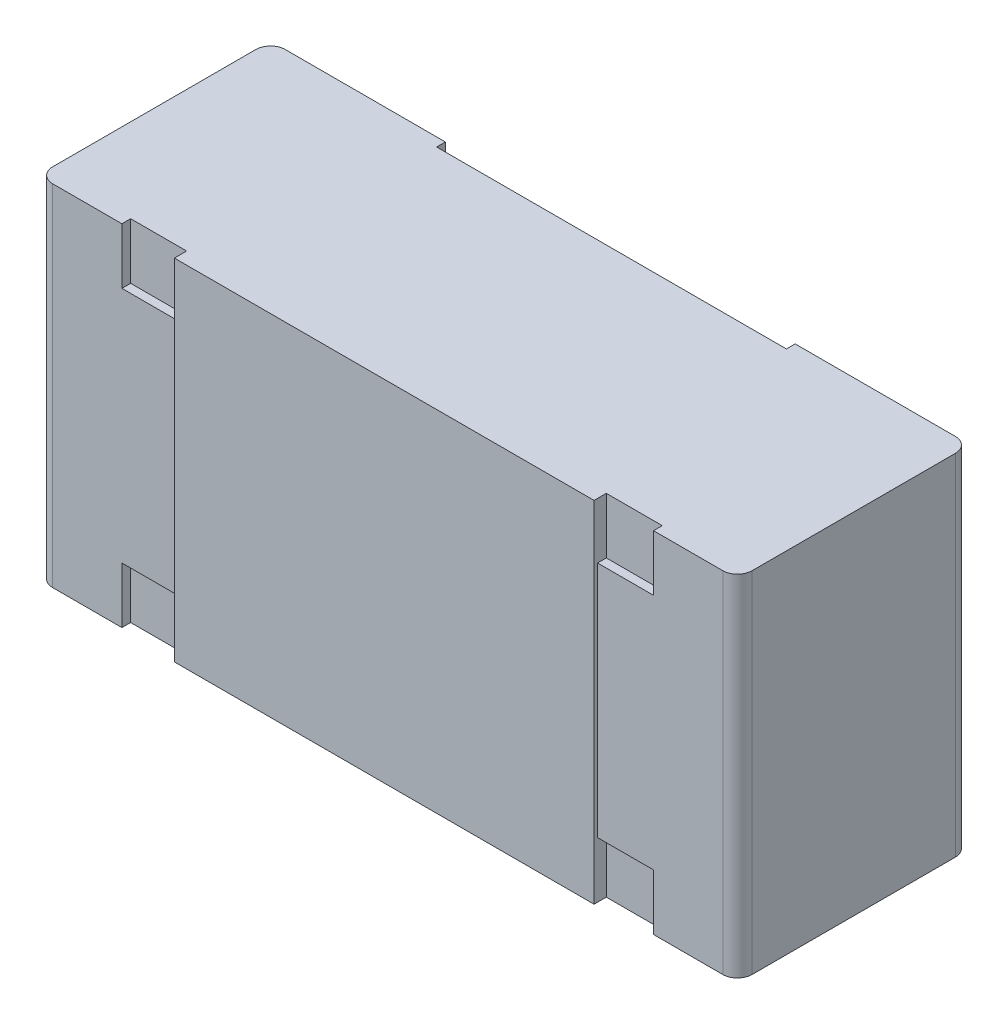
ISO-10303-21;
HEADER;
FILE_DESCRIPTION(('STEP AP214'),'2;1');
FILE_NAME('part.step','',(''),(''),'','','');
FILE_SCHEMA(('AUTOMOTIVE_DESIGN { 1 0 10303 214 1 1 1 1 }'));
ENDSEC;
DATA;
#1=APPLICATION_CONTEXT('core data for automotive mechanical design processes');
#2=APPLICATION_PROTOCOL_DEFINITION('international standard','automotive_design',2000,#1);
#3=PRODUCT_CONTEXT('',#1,'mechanical');
#4=PRODUCT('Part','Part','',(#3));
#5=PRODUCT_RELATED_PRODUCT_CATEGORY('part','',(#4));
#6=PRODUCT_DEFINITION_FORMATION('','',#4);
#7=PRODUCT_DEFINITION_CONTEXT('part definition',#1,'design');
#8=PRODUCT_DEFINITION('design','',#6,#7);
#9=PRODUCT_DEFINITION_SHAPE('','',#8);
#10=(LENGTH_UNIT() NAMED_UNIT(*) SI_UNIT(.MILLI.,.METRE.));
#11=(NAMED_UNIT(*) PLANE_ANGLE_UNIT() SI_UNIT($,.RADIAN.));
#12=(NAMED_UNIT(*) SI_UNIT($,.STERADIAN.) SOLID_ANGLE_UNIT());
#13=UNCERTAINTY_MEASURE_WITH_UNIT(LENGTH_MEASURE(1.E-05),#10,'distance_accuracy_value','');
#14=(GEOMETRIC_REPRESENTATION_CONTEXT(3) GLOBAL_UNCERTAINTY_ASSIGNED_CONTEXT((#13)) GLOBAL_UNIT_ASSIGNED_CONTEXT((#10,
#11,#12)) REPRESENTATION_CONTEXT('',''));
#15=CARTESIAN_POINT('',(0.,0.,0.));
#16=DIRECTION('',(0.,0.,1.));
#17=DIRECTION('',(1.,0.,0.));
#18=AXIS2_PLACEMENT_3D('',#15,#16,#17);
#19=CARTESIAN_POINT('',(-0.5,0.,0.3325));
#20=DIRECTION('',(1.,0.,0.));
#21=DIRECTION('',(0.,0.,-1.));
#22=AXIS2_PLACEMENT_3D('',#19,#20,#21);
#23=PLANE('',#22);
#24=DIRECTION('',(0.,-1.,0.));
#25=VECTOR('',#24,1.);
#26=CARTESIAN_POINT('',(-0.5,0.,0.3115));
#27=LINE('',#26,#25);
#28=CARTESIAN_POINT('',(-0.5,0.25,0.3115));
#29=VERTEX_POINT('',#28);
#30=CARTESIAN_POINT('',(-0.5,-0.25,0.3115));
#31=VERTEX_POINT('',#30);
#32=EDGE_CURVE('E206',#29,#31,#27,.T.);
#33=ORIENTED_EDGE('',*,*,#32,.F.);
#34=DIRECTION('',(0.,0.,-1.));
#35=VECTOR('',#34,1.);
#36=CARTESIAN_POINT('',(-0.5,0.25,0.));
#37=LINE('',#36,#35);
#38=CARTESIAN_POINT('',(-0.5,0.25,0.021));
#39=VERTEX_POINT('',#38);
#40=EDGE_CURVE('E281',#29,#39,#37,.T.);
#41=ORIENTED_EDGE('',*,*,#40,.T.);
#42=DIRECTION('',(0.,-1.,0.));
#43=VECTOR('',#42,1.);
#44=CARTESIAN_POINT('',(-0.5,0.,0.021));
#45=LINE('',#44,#43);
#46=CARTESIAN_POINT('',(-0.5,-0.25,0.021));
#47=VERTEX_POINT('',#46);
#48=EDGE_CURVE('E266',#47,#39,#45,.F.);
#49=ORIENTED_EDGE('',*,*,#48,.F.);
#50=DIRECTION('',(0.,0.,-1.));
#51=VECTOR('',#50,1.);
#52=CARTESIAN_POINT('',(-0.5,-0.25,0.021));
#53=LINE('',#52,#51);
#54=EDGE_CURVE('E210',#31,#47,#53,.T.);
#55=ORIENTED_EDGE('',*,*,#54,.F.);
#56=EDGE_LOOP('',(#33,#41,#49,#55));
#57=FACE_BOUND('',#56,.T.);
#58=ADVANCED_FACE('F17',(#57),#23,.F.);
#59=CARTESIAN_POINT('',(-0.479,0.,0.021));
#60=DIRECTION('',(0.,-1.,0.));
#61=DIRECTION('',(0.,0.,-1.));
#62=AXIS2_PLACEMENT_3D('',#59,#60,#61);
#63=CYLINDRICAL_SURFACE('',#62,0.021);
#64=CARTESIAN_POINT('',(-0.479,0.25,0.021));
#65=DIRECTION('',(0.,-1.,0.));
#66=DIRECTION('',(0.,0.,-1.));
#67=AXIS2_PLACEMENT_3D('',#64,#65,#66);
#68=CIRCLE('',#67,0.021);
#69=CARTESIAN_POINT('',(-0.479,0.25,0.));
#70=VERTEX_POINT('',#69);
#71=EDGE_CURVE('E278',#39,#70,#68,.T.);
#72=ORIENTED_EDGE('',*,*,#71,.T.);
#73=DIRECTION('',(0.,1.,0.));
#74=VECTOR('',#73,1.);
#75=CARTESIAN_POINT('',(-0.479,0.,0.));
#76=LINE('',#75,#74);
#77=CARTESIAN_POINT('',(-0.479,-0.25,0.));
#78=VERTEX_POINT('',#77);
#79=EDGE_CURVE('E262',#70,#78,#76,.F.);
#80=ORIENTED_EDGE('',*,*,#79,.T.);
#81=CARTESIAN_POINT('',(-0.479,-0.25,0.021));
#82=DIRECTION('',(0.,-1.,0.));
#83=DIRECTION('',(0.,0.,-1.));
#84=AXIS2_PLACEMENT_3D('',#81,#82,#83);
#85=CIRCLE('',#84,0.021);
#86=EDGE_CURVE('E293',#47,#78,#85,.T.);
#87=ORIENTED_EDGE('',*,*,#86,.F.);
#88=ORIENTED_EDGE('',*,*,#48,.T.);
#89=EDGE_LOOP('',(#72,#80,#87,#88));
#90=FACE_BOUND('',#89,.T.);
#91=ADVANCED_FACE('F549',(#90),#63,.T.);
#92=CARTESIAN_POINT('',(-0.5,0.,0.));
#93=DIRECTION('',(0.,0.,1.));
#94=DIRECTION('',(1.,0.,0.));
#95=AXIS2_PLACEMENT_3D('',#92,#93,#94);
#96=PLANE('',#95);
#97=DIRECTION('',(0.,1.,0.));
#98=VECTOR('',#97,1.);
#99=CARTESIAN_POINT('',(-0.25,0.,0.));
#100=LINE('',#99,#98);
#101=CARTESIAN_POINT('',(-0.25,-0.25,0.));
#102=VERTEX_POINT('',#101);
#103=CARTESIAN_POINT('',(-0.25,0.25,0.));
#104=VERTEX_POINT('',#103);
#105=EDGE_CURVE('E259',#102,#104,#100,.T.);
#106=ORIENTED_EDGE('',*,*,#105,.F.);
#107=DIRECTION('',(1.,0.,0.));
#108=VECTOR('',#107,1.);
#109=CARTESIAN_POINT('',(0.479,-0.25,0.));
#110=LINE('',#109,#108);
#111=EDGE_CURVE('E254',#78,#102,#110,.T.);
#112=ORIENTED_EDGE('',*,*,#111,.F.);
#113=ORIENTED_EDGE('',*,*,#79,.F.);
#114=DIRECTION('',(1.,0.,0.));
#115=VECTOR('',#114,1.);
#116=CARTESIAN_POINT('',(0.25,0.25,0.));
#117=LINE('',#116,#115);
#118=EDGE_CURVE('E280',#70,#104,#117,.T.);
#119=ORIENTED_EDGE('',*,*,#118,.T.);
#120=EDGE_LOOP('',(#106,#112,#113,#119));
#121=FACE_BOUND('',#120,.T.);
#122=ADVANCED_FACE('F546',(#121),#96,.F.);
#123=CARTESIAN_POINT('',(-0.25,0.,0.));
#124=DIRECTION('',(1.,0.,0.));
#125=DIRECTION('',(0.,0.,-1.));
#126=AXIS2_PLACEMENT_3D('',#123,#124,#125);
#127=PLANE('',#126);
#128=DIRECTION('',(0.,0.,-1.));
#129=VECTOR('',#128,1.);
#130=CARTESIAN_POINT('',(-0.25,0.25,0.));
#131=LINE('',#130,#129);
#132=CARTESIAN_POINT('',(-0.25,0.25,0.0125));
#133=VERTEX_POINT('',#132);
#134=EDGE_CURVE('E408',#104,#133,#131,.F.);
#135=ORIENTED_EDGE('',*,*,#134,.T.);
#136=DIRECTION('',(0.,1.,0.));
#137=VECTOR('',#136,1.);
#138=CARTESIAN_POINT('',(-0.25,1.272341063442,0.0125));
#139=LINE('',#138,#137);
#140=CARTESIAN_POINT('',(-0.25,-0.25,0.0125));
#141=VERTEX_POINT('',#140);
#142=EDGE_CURVE('E404',#133,#141,#139,.F.);
#143=ORIENTED_EDGE('',*,*,#142,.T.);
#144=DIRECTION('',(0.,0.,-1.));
#145=VECTOR('',#144,1.);
#146=CARTESIAN_POINT('',(-0.25,-0.25,0.021));
#147=LINE('',#146,#145);
#148=EDGE_CURVE('E270',#102,#141,#147,.F.);
#149=ORIENTED_EDGE('',*,*,#148,.F.);
#150=ORIENTED_EDGE('',*,*,#105,.T.);
#151=EDGE_LOOP('',(#135,#143,#149,#150));
#152=FACE_BOUND('',#151,.T.);
#153=ADVANCED_FACE('F543',(#152),#127,.T.);
#154=CARTESIAN_POINT('',(0.25,0.,0.));
#155=DIRECTION('',(0.,0.,1.));
#156=DIRECTION('',(1.,0.,0.));
#157=AXIS2_PLACEMENT_3D('',#154,#155,#156);
#158=PLANE('',#157);
#159=DIRECTION('',(0.,1.,0.));
#160=VECTOR('',#159,1.);
#161=CARTESIAN_POINT('',(0.25,0.,0.));
#162=LINE('',#161,#160);
#163=CARTESIAN_POINT('',(0.25,-0.25,0.));
#164=VERTEX_POINT('',#163);
#165=CARTESIAN_POINT('',(0.25,0.25,0.));
#166=VERTEX_POINT('',#165);
#167=EDGE_CURVE('E245',#164,#166,#162,.T.);
#168=ORIENTED_EDGE('',*,*,#167,.T.);
#169=DIRECTION('',(1.,0.,0.));
#170=VECTOR('',#169,1.);
#171=CARTESIAN_POINT('',(0.25,0.25,0.));
#172=LINE('',#171,#170);
#173=CARTESIAN_POINT('',(0.479,0.25,0.));
#174=VERTEX_POINT('',#173);
#175=EDGE_CURVE('E277',#166,#174,#172,.T.);
#176=ORIENTED_EDGE('',*,*,#175,.T.);
#177=DIRECTION('',(0.,-1.,0.));
#178=VECTOR('',#177,1.);
#179=CARTESIAN_POINT('',(0.479,0.,0.));
#180=LINE('',#179,#178);
#181=CARTESIAN_POINT('',(0.479,-0.25,0.));
#182=VERTEX_POINT('',#181);
#183=EDGE_CURVE('E256',#182,#174,#180,.F.);
#184=ORIENTED_EDGE('',*,*,#183,.F.);
#185=DIRECTION('',(1.,0.,0.));
#186=VECTOR('',#185,1.);
#187=CARTESIAN_POINT('',(0.479,-0.25,0.));
#188=LINE('',#187,#186);
#189=EDGE_CURVE('E292',#164,#182,#188,.T.);
#190=ORIENTED_EDGE('',*,*,#189,.F.);
#191=EDGE_LOOP('',(#168,#176,#184,#190));
#192=FACE_BOUND('',#191,.T.);
#193=ADVANCED_FACE('F530',(#192),#158,.F.);
#194=CARTESIAN_POINT('',(0.479,0.,0.021));
#195=DIRECTION('',(0.,-1.,0.));
#196=DIRECTION('',(0.,0.,-1.));
#197=AXIS2_PLACEMENT_3D('',#194,#195,#196);
#198=CYLINDRICAL_SURFACE('',#197,0.021);
#199=CARTESIAN_POINT('',(0.479,0.25,0.021));
#200=DIRECTION('',(0.,-1.,0.));
#201=DIRECTION('',(0.,0.,-1.));
#202=AXIS2_PLACEMENT_3D('',#199,#200,#201);
#203=CIRCLE('',#202,0.021);
#204=CARTESIAN_POINT('',(0.5,0.25,0.021));
#205=VERTEX_POINT('',#204);
#206=EDGE_CURVE('E275',#174,#205,#203,.T.);
#207=ORIENTED_EDGE('',*,*,#206,.T.);
#208=DIRECTION('',(0.,1.,0.));
#209=VECTOR('',#208,1.);
#210=CARTESIAN_POINT('',(0.5,0.,0.021));
#211=LINE('',#210,#209);
#212=CARTESIAN_POINT('',(0.5,-0.25,0.021));
#213=VERTEX_POINT('',#212);
#214=EDGE_CURVE('E247',#205,#213,#211,.F.);
#215=ORIENTED_EDGE('',*,*,#214,.T.);
#216=CARTESIAN_POINT('',(0.479,-0.25,0.021));
#217=DIRECTION('',(0.,-1.,0.));
#218=DIRECTION('',(0.,0.,-1.));
#219=AXIS2_PLACEMENT_3D('',#216,#217,#218);
#220=CIRCLE('',#219,0.021);
#221=EDGE_CURVE('E290',#182,#213,#220,.T.);
#222=ORIENTED_EDGE('',*,*,#221,.F.);
#223=ORIENTED_EDGE('',*,*,#183,.T.);
#224=EDGE_LOOP('',(#207,#215,#222,#223));
#225=FACE_BOUND('',#224,.T.);
#226=ADVANCED_FACE('F533',(#225),#198,.T.);
#227=CARTESIAN_POINT('',(0.5,0.,0.));
#228=DIRECTION('',(-1.,0.,0.));
#229=DIRECTION('',(0.,0.,1.));
#230=AXIS2_PLACEMENT_3D('',#227,#228,#229);
#231=PLANE('',#230);
#232=DIRECTION('',(0.,-1.,0.));
#233=VECTOR('',#232,1.);
#234=CARTESIAN_POINT('',(0.5,0.,0.3115));
#235=LINE('',#234,#233);
#236=CARTESIAN_POINT('',(0.5,-0.25,0.3115));
#237=VERTEX_POINT('',#236);
#238=CARTESIAN_POINT('',(0.5,0.25,0.3115));
#239=VERTEX_POINT('',#238);
#240=EDGE_CURVE('E250',#237,#239,#235,.F.);
#241=ORIENTED_EDGE('',*,*,#240,.F.);
#242=DIRECTION('',(0.,0.,-1.));
#243=VECTOR('',#242,1.);
#244=CARTESIAN_POINT('',(0.5,-0.25,0.021));
#245=LINE('',#244,#243);
#246=EDGE_CURVE('E289',#213,#237,#245,.F.);
#247=ORIENTED_EDGE('',*,*,#246,.F.);
#248=ORIENTED_EDGE('',*,*,#214,.F.);
#249=DIRECTION('',(0.,0.,-1.));
#250=VECTOR('',#249,1.);
#251=CARTESIAN_POINT('',(0.5,0.25,0.));
#252=LINE('',#251,#250);
#253=EDGE_CURVE('E274',#205,#239,#252,.F.);
#254=ORIENTED_EDGE('',*,*,#253,.T.);
#255=EDGE_LOOP('',(#241,#247,#248,#254));
#256=FACE_BOUND('',#255,.T.);
#257=ADVANCED_FACE('F635',(#256),#231,.F.);
#258=CARTESIAN_POINT('',(0.25,0.,0.));
#259=DIRECTION('',(1.,0.,0.));
#260=DIRECTION('',(0.,0.,-1.));
#261=AXIS2_PLACEMENT_3D('',#258,#259,#260);
#262=PLANE('',#261);
#263=ORIENTED_EDGE('',*,*,#167,.F.);
#264=DIRECTION('',(0.,0.,-1.));
#265=VECTOR('',#264,1.);
#266=CARTESIAN_POINT('',(0.25,-0.25,0.021));
#267=LINE('',#266,#265);
#268=CARTESIAN_POINT('',(0.25,-0.25,0.0125));
#269=VERTEX_POINT('',#268);
#270=EDGE_CURVE('E253',#269,#164,#267,.T.);
#271=ORIENTED_EDGE('',*,*,#270,.F.);
#272=DIRECTION('',(0.,1.,0.));
#273=VECTOR('',#272,1.);
#274=CARTESIAN_POINT('',(0.25,1.272341063442,0.0125));
#275=LINE('',#274,#273);
#276=CARTESIAN_POINT('',(0.25,0.25,0.0125));
#277=VERTEX_POINT('',#276);
#278=EDGE_CURVE('E402',#269,#277,#275,.T.);
#279=ORIENTED_EDGE('',*,*,#278,.T.);
#280=DIRECTION('',(0.,0.,-1.));
#281=VECTOR('',#280,1.);
#282=CARTESIAN_POINT('',(0.25,0.25,0.));
#283=LINE('',#282,#281);
#284=EDGE_CURVE('E236',#277,#166,#283,.T.);
#285=ORIENTED_EDGE('',*,*,#284,.T.);
#286=EDGE_LOOP('',(#263,#271,#279,#285));
#287=FACE_BOUND('',#286,.T.);
#288=ADVANCED_FACE('F522',(#287),#262,.F.);
#289=CARTESIAN_POINT('',(-0.479,0.,0.3115));
#290=DIRECTION('',(0.,-1.,0.));
#291=DIRECTION('',(0.,0.,-1.));
#292=AXIS2_PLACEMENT_3D('',#289,#290,#291);
#293=CYLINDRICAL_SURFACE('',#292,0.021);
#294=CARTESIAN_POINT('',(-0.479,0.25,0.3115));
#295=DIRECTION('',(0.,-1.,0.));
#296=DIRECTION('',(0.,0.,-1.));
#297=AXIS2_PLACEMENT_3D('',#294,#295,#296);
#298=CIRCLE('',#297,0.021);
#299=CARTESIAN_POINT('',(-0.479,0.25,0.3325));
#300=VERTEX_POINT('',#299);
#301=EDGE_CURVE('E282',#300,#29,#298,.T.);
#302=ORIENTED_EDGE('',*,*,#301,.T.);
#303=ORIENTED_EDGE('',*,*,#32,.T.);
#304=CARTESIAN_POINT('',(-0.479,-0.25,0.3115));
#305=DIRECTION('',(0.,-1.,0.));
#306=DIRECTION('',(0.,0.,-1.));
#307=AXIS2_PLACEMENT_3D('',#304,#305,#306);
#308=CIRCLE('',#307,0.021);
#309=CARTESIAN_POINT('',(-0.479,-0.25,0.3325));
#310=VERTEX_POINT('',#309);
#311=EDGE_CURVE('E20',#310,#31,#308,.T.);
#312=ORIENTED_EDGE('',*,*,#311,.F.);
#313=DIRECTION('',(0.,1.,0.));
#314=VECTOR('',#313,1.);
#315=CARTESIAN_POINT('',(-0.479,0.,0.3325));
#316=LINE('',#315,#314);
#317=EDGE_CURVE('E204',#310,#300,#316,.T.);
#318=ORIENTED_EDGE('',*,*,#317,.T.);
#319=EDGE_LOOP('',(#302,#303,#312,#318));
#320=FACE_BOUND('',#319,.T.);
#321=ADVANCED_FACE('F202',(#320),#293,.T.);
#322=CARTESIAN_POINT('',(-0.38,0.25,0.20686291501));
#323=DIRECTION('',(-1.,0.,0.));
#324=DIRECTION('',(0.,0.,1.));
#325=AXIS2_PLACEMENT_3D('',#322,#323,#324);
#326=PLANE('',#325);
#327=DIRECTION('',(0.,1.,0.));
#328=VECTOR('',#327,1.);
#329=CARTESIAN_POINT('',(-0.38,0.,0.3325));
#330=LINE('',#329,#328);
#331=CARTESIAN_POINT('',(-0.38,0.25,0.3325));
#332=VERTEX_POINT('',#331);
#333=CARTESIAN_POINT('',(-0.38,0.17,0.3325));
#334=VERTEX_POINT('',#333);
#335=EDGE_CURVE('E228',#332,#334,#330,.F.);
#336=ORIENTED_EDGE('',*,*,#335,.T.);
#337=DIRECTION('',(0.,0.,-1.));
#338=VECTOR('',#337,1.);
#339=CARTESIAN_POINT('',(-0.38,0.17,0.20686291501));
#340=LINE('',#339,#338);
#341=CARTESIAN_POINT('',(-0.38,0.17,0.32));
#342=VERTEX_POINT('',#341);
#343=EDGE_CURVE('E361',#334,#342,#340,.T.);
#344=ORIENTED_EDGE('',*,*,#343,.T.);
#345=DIRECTION('',(0.,1.,0.));
#346=VECTOR('',#345,1.);
#347=CARTESIAN_POINT('',(-0.38,1.272341063442,0.32));
#348=LINE('',#347,#346);
#349=CARTESIAN_POINT('',(-0.38,0.25,0.32));
#350=VERTEX_POINT('',#349);
#351=EDGE_CURVE('E313',#342,#350,#348,.T.);
#352=ORIENTED_EDGE('',*,*,#351,.T.);
#353=DIRECTION('',(0.,0.,-1.));
#354=VECTOR('',#353,1.);
#355=CARTESIAN_POINT('',(-0.38,0.25,0.));
#356=LINE('',#355,#354);
#357=EDGE_CURVE('E284',#350,#332,#356,.F.);
#358=ORIENTED_EDGE('',*,*,#357,.T.);
#359=EDGE_LOOP('',(#336,#344,#352,#358));
#360=FACE_BOUND('',#359,.T.);
#361=ADVANCED_FACE('F626',(#360),#326,.F.);
#362=CARTESIAN_POINT('',(-0.38,-0.25,0.20686291501));
#363=DIRECTION('',(-1.,0.,0.));
#364=DIRECTION('',(0.,0.,1.));
#365=AXIS2_PLACEMENT_3D('',#362,#363,#364);
#366=PLANE('',#365);
#367=DIRECTION('',(0.,1.,0.));
#368=VECTOR('',#367,1.);
#369=CARTESIAN_POINT('',(-0.38,0.,0.3325));
#370=LINE('',#369,#368);
#371=CARTESIAN_POINT('',(-0.38,-0.17,0.3325));
#372=VERTEX_POINT('',#371);
#373=CARTESIAN_POINT('',(-0.38,-0.25,0.3325));
#374=VERTEX_POINT('',#373);
#375=EDGE_CURVE('E220',#372,#374,#370,.F.);
#376=ORIENTED_EDGE('',*,*,#375,.T.);
#377=DIRECTION('',(0.,0.,-1.));
#378=VECTOR('',#377,1.);
#379=CARTESIAN_POINT('',(-0.38,-0.25,0.021));
#380=LINE('',#379,#378);
#381=CARTESIAN_POINT('',(-0.38,-0.25,0.32));
#382=VERTEX_POINT('',#381);
#383=EDGE_CURVE('E211',#382,#374,#380,.F.);
#384=ORIENTED_EDGE('',*,*,#383,.F.);
#385=DIRECTION('',(0.,1.,0.));
#386=VECTOR('',#385,1.);
#387=CARTESIAN_POINT('',(-0.38,1.272341063442,0.32));
#388=LINE('',#387,#386);
#389=CARTESIAN_POINT('',(-0.38,-0.17,0.32));
#390=VERTEX_POINT('',#389);
#391=EDGE_CURVE('E310',#382,#390,#388,.T.);
#392=ORIENTED_EDGE('',*,*,#391,.T.);
#393=DIRECTION('',(0.,0.,1.));
#394=VECTOR('',#393,1.);
#395=CARTESIAN_POINT('',(-0.38,-0.17,0.20686291501));
#396=LINE('',#395,#394);
#397=EDGE_CURVE('E242',#390,#372,#396,.T.);
#398=ORIENTED_EDGE('',*,*,#397,.T.);
#399=EDGE_LOOP('',(#376,#384,#392,#398));
#400=FACE_BOUND('',#399,.T.);
#401=ADVANCED_FACE('F622',(#400),#366,.F.);
#402=CARTESIAN_POINT('',(0.479,0.,0.3115));
#403=DIRECTION('',(0.,-1.,0.));
#404=DIRECTION('',(0.,0.,-1.));
#405=AXIS2_PLACEMENT_3D('',#402,#403,#404);
#406=CYLINDRICAL_SURFACE('',#405,0.021);
#407=CARTESIAN_POINT('',(0.479,0.25,0.3115));
#408=DIRECTION('',(0.,-1.,0.));
#409=DIRECTION('',(0.,0.,-1.));
#410=AXIS2_PLACEMENT_3D('',#407,#408,#409);
#411=CIRCLE('',#410,0.021);
#412=CARTESIAN_POINT('',(0.479,0.25,0.3325));
#413=VERTEX_POINT('',#412);
#414=EDGE_CURVE('E271',#239,#413,#411,.T.);
#415=ORIENTED_EDGE('',*,*,#414,.T.);
#416=DIRECTION('',(0.,1.,0.));
#417=VECTOR('',#416,1.);
#418=CARTESIAN_POINT('',(0.479,0.,0.3325));
#419=LINE('',#418,#417);
#420=CARTESIAN_POINT('',(0.479,-0.25,0.3325));
#421=VERTEX_POINT('',#420);
#422=EDGE_CURVE('E460',#413,#421,#419,.F.);
#423=ORIENTED_EDGE('',*,*,#422,.T.);
#424=CARTESIAN_POINT('',(0.479,-0.25,0.3115));
#425=DIRECTION('',(0.,-1.,0.));
#426=DIRECTION('',(0.,0.,-1.));
#427=AXIS2_PLACEMENT_3D('',#424,#425,#426);
#428=CIRCLE('',#427,0.021);
#429=EDGE_CURVE('E285',#237,#421,#428,.T.);
#430=ORIENTED_EDGE('',*,*,#429,.F.);
#431=ORIENTED_EDGE('',*,*,#240,.T.);
#432=EDGE_LOOP('',(#415,#423,#430,#431));
#433=FACE_BOUND('',#432,.T.);
#434=ADVANCED_FACE('F618',(#433),#406,.T.);
#435=CARTESIAN_POINT('',(0.38,-0.25,0.20686291501));
#436=DIRECTION('',(1.,0.,0.));
#437=DIRECTION('',(0.,1.,0.));
#438=AXIS2_PLACEMENT_3D('',#435,#436,#437);
#439=PLANE('',#438);
#440=DIRECTION('',(0.,1.,0.));
#441=VECTOR('',#440,1.);
#442=CARTESIAN_POINT('',(0.38,0.,0.3325));
#443=LINE('',#442,#441);
#444=CARTESIAN_POINT('',(0.38,-0.25,0.3325));
#445=VERTEX_POINT('',#444);
#446=CARTESIAN_POINT('',(0.38,-0.17,0.3325));
#447=VERTEX_POINT('',#446);
#448=EDGE_CURVE('E465',#445,#447,#443,.T.);
#449=ORIENTED_EDGE('',*,*,#448,.T.);
#450=DIRECTION('',(0.,0.,1.));
#451=VECTOR('',#450,1.);
#452=CARTESIAN_POINT('',(0.38,-0.17,0.20686291501));
#453=LINE('',#452,#451);
#454=CARTESIAN_POINT('',(0.38,-0.17,0.32));
#455=VERTEX_POINT('',#454);
#456=EDGE_CURVE('E337',#447,#455,#453,.F.);
#457=ORIENTED_EDGE('',*,*,#456,.T.);
#458=DIRECTION('',(0.,1.,0.));
#459=VECTOR('',#458,1.);
#460=CARTESIAN_POINT('',(0.38,1.272341063442,0.32));
#461=LINE('',#460,#459);
#462=CARTESIAN_POINT('',(0.38,-0.25,0.32));
#463=VERTEX_POINT('',#462);
#464=EDGE_CURVE('E328',#455,#463,#461,.F.);
#465=ORIENTED_EDGE('',*,*,#464,.T.);
#466=DIRECTION('',(0.,0.,1.));
#467=VECTOR('',#466,1.);
#468=CARTESIAN_POINT('',(0.38,-0.25,0.20686291501));
#469=LINE('',#468,#467);
#470=EDGE_CURVE('E288',#445,#463,#469,.F.);
#471=ORIENTED_EDGE('',*,*,#470,.F.);
#472=EDGE_LOOP('',(#449,#457,#465,#471));
#473=FACE_BOUND('',#472,.T.);
#474=ADVANCED_FACE('F614',(#473),#439,.F.);
#475=CARTESIAN_POINT('',(0.38,0.25,0.20686291501));
#476=DIRECTION('',(1.,0.,0.));
#477=DIRECTION('',(0.,0.,-1.));
#478=AXIS2_PLACEMENT_3D('',#475,#476,#477);
#479=PLANE('',#478);
#480=DIRECTION('',(0.,1.,0.));
#481=VECTOR('',#480,1.);
#482=CARTESIAN_POINT('',(0.38,0.,0.3325));
#483=LINE('',#482,#481);
#484=CARTESIAN_POINT('',(0.38,0.17,0.3325));
#485=VERTEX_POINT('',#484);
#486=CARTESIAN_POINT('',(0.38,0.25,0.3325));
#487=VERTEX_POINT('',#486);
#488=EDGE_CURVE('E307',#485,#487,#483,.T.);
#489=ORIENTED_EDGE('',*,*,#488,.T.);
#490=DIRECTION('',(0.,0.,-1.));
#491=VECTOR('',#490,1.);
#492=CARTESIAN_POINT('',(0.38,0.25,0.));
#493=LINE('',#492,#491);
#494=CARTESIAN_POINT('',(0.38,0.25,0.32));
#495=VERTEX_POINT('',#494);
#496=EDGE_CURVE('E273',#487,#495,#493,.T.);
#497=ORIENTED_EDGE('',*,*,#496,.T.);
#498=DIRECTION('',(0.,1.,0.));
#499=VECTOR('',#498,1.);
#500=CARTESIAN_POINT('',(0.38,1.272341063442,0.32));
#501=LINE('',#500,#499);
#502=CARTESIAN_POINT('',(0.38,0.17,0.32));
#503=VERTEX_POINT('',#502);
#504=EDGE_CURVE('E331',#495,#503,#501,.F.);
#505=ORIENTED_EDGE('',*,*,#504,.T.);
#506=DIRECTION('',(0.,0.,-1.));
#507=VECTOR('',#506,1.);
#508=CARTESIAN_POINT('',(0.38,0.17,0.20686291501));
#509=LINE('',#508,#507);
#510=EDGE_CURVE('E448',#503,#485,#509,.F.);
#511=ORIENTED_EDGE('',*,*,#510,.T.);
#512=EDGE_LOOP('',(#489,#497,#505,#511));
#513=FACE_BOUND('',#512,.T.);
#514=ADVANCED_FACE('F611',(#513),#479,.F.);
#515=CARTESIAN_POINT('',(-0.479,1.272341063442,0.0125));
#516=DIRECTION('',(0.,0.,1.));
#517=DIRECTION('',(1.,0.,0.));
#518=AXIS2_PLACEMENT_3D('',#515,#516,#517);
#519=PLANE('',#518);
#520=ORIENTED_EDGE('',*,*,#278,.F.);
#521=DIRECTION('',(1.,0.,0.));
#522=VECTOR('',#521,1.);
#523=CARTESIAN_POINT('',(0.479,-0.25,0.0125));
#524=LINE('',#523,#522);
#525=EDGE_CURVE('E241',#141,#269,#524,.T.);
#526=ORIENTED_EDGE('',*,*,#525,.F.);
#527=ORIENTED_EDGE('',*,*,#142,.F.);
#528=DIRECTION('',(1.,0.,0.));
#529=VECTOR('',#528,1.);
#530=CARTESIAN_POINT('',(0.25,0.25,0.0125));
#531=LINE('',#530,#529);
#532=EDGE_CURVE('E381',#133,#277,#531,.T.);
#533=ORIENTED_EDGE('',*,*,#532,.T.);
#534=EDGE_LOOP('',(#520,#526,#527,#533));
#535=FACE_BOUND('',#534,.T.);
#536=ADVANCED_FACE('F537',(#535),#519,.F.);
#537=CARTESIAN_POINT('',(0.5,0.,0.3325));
#538=DIRECTION('',(0.,0.,-1.));
#539=DIRECTION('',(-1.,0.,0.));
#540=AXIS2_PLACEMENT_3D('',#537,#538,#539);
#541=PLANE('',#540);
#542=ORIENTED_EDGE('',*,*,#335,.F.);
#543=DIRECTION('',(-1.,0.,0.));
#544=VECTOR('',#543,1.);
#545=CARTESIAN_POINT('',(0.5,0.25,0.3325));
#546=LINE('',#545,#544);
#547=EDGE_CURVE('E226',#300,#332,#546,.F.);
#548=ORIENTED_EDGE('',*,*,#547,.F.);
#549=ORIENTED_EDGE('',*,*,#317,.F.);
#550=DIRECTION('',(-1.,0.,0.));
#551=VECTOR('',#550,1.);
#552=CARTESIAN_POINT('',(0.5,-0.25,0.3325));
#553=LINE('',#552,#551);
#554=EDGE_CURVE('E214',#374,#310,#553,.T.);
#555=ORIENTED_EDGE('',*,*,#554,.F.);
#556=ORIENTED_EDGE('',*,*,#375,.F.);
#557=DIRECTION('',(1.,0.,0.));
#558=VECTOR('',#557,1.);
#559=CARTESIAN_POINT('',(-0.3,-0.17,0.3325));
#560=LINE('',#559,#558);
#561=CARTESIAN_POINT('',(-0.3,-0.17,0.3325));
#562=VERTEX_POINT('',#561);
#563=EDGE_CURVE('E239',#372,#562,#560,.T.);
#564=ORIENTED_EDGE('',*,*,#563,.T.);
#565=DIRECTION('',(0.,1.,0.));
#566=VECTOR('',#565,1.);
#567=CARTESIAN_POINT('',(-0.3,0.25,0.3325));
#568=LINE('',#567,#566);
#569=CARTESIAN_POINT('',(-0.3,0.17,0.3325));
#570=VERTEX_POINT('',#569);
#571=EDGE_CURVE('E370',#562,#570,#568,.T.);
#572=ORIENTED_EDGE('',*,*,#571,.T.);
#573=DIRECTION('',(1.,0.,0.));
#574=VECTOR('',#573,1.);
#575=CARTESIAN_POINT('',(-0.3,0.17,0.3325));
#576=LINE('',#575,#574);
#577=EDGE_CURVE('E365',#570,#334,#576,.F.);
#578=ORIENTED_EDGE('',*,*,#577,.T.);
#579=EDGE_LOOP('',(#542,#548,#549,#555,#556,#564,#572,#578));
#580=FACE_BOUND('',#579,.T.);
#581=ADVANCED_FACE('F224',(#580),#541,.F.);
#582=CARTESIAN_POINT('',(-0.3,0.17,0.20686291501));
#583=DIRECTION('',(0.,-1.,0.));
#584=DIRECTION('',(0.,0.,-1.));
#585=AXIS2_PLACEMENT_3D('',#582,#583,#584);
#586=PLANE('',#585);
#587=ORIENTED_EDGE('',*,*,#577,.F.);
#588=DIRECTION('',(0.,0.,-1.));
#589=VECTOR('',#588,1.);
#590=CARTESIAN_POINT('',(-0.3,0.17,0.3375));
#591=LINE('',#590,#589);
#592=CARTESIAN_POINT('',(-0.3,0.17,0.32));
#593=VERTEX_POINT('',#592);
#594=EDGE_CURVE('E368',#570,#593,#591,.T.);
#595=ORIENTED_EDGE('',*,*,#594,.T.);
#596=DIRECTION('',(-1.,0.,0.));
#597=VECTOR('',#596,1.);
#598=CARTESIAN_POINT('',(0.479,0.17,0.32));
#599=LINE('',#598,#597);
#600=EDGE_CURVE('E358',#593,#342,#599,.T.);
#601=ORIENTED_EDGE('',*,*,#600,.T.);
#602=ORIENTED_EDGE('',*,*,#343,.F.);
#603=EDGE_LOOP('',(#587,#595,#601,#602));
#604=FACE_BOUND('',#603,.T.);
#605=ADVANCED_FACE('F602',(#604),#586,.F.);
#606=CARTESIAN_POINT('',(0.479,1.272341063442,0.32));
#607=DIRECTION('',(0.,0.,-1.));
#608=DIRECTION('',(-1.,0.,0.));
#609=AXIS2_PLACEMENT_3D('',#606,#607,#608);
#610=PLANE('',#609);
#611=ORIENTED_EDGE('',*,*,#600,.F.);
#612=DIRECTION('',(0.,1.,0.));
#613=VECTOR('',#612,1.);
#614=CARTESIAN_POINT('',(-0.3,0.25,0.32));
#615=LINE('',#614,#613);
#616=CARTESIAN_POINT('',(-0.3,0.25,0.32));
#617=VERTEX_POINT('',#616);
#618=EDGE_CURVE('E319',#593,#617,#615,.T.);
#619=ORIENTED_EDGE('',*,*,#618,.T.);
#620=DIRECTION('',(1.,0.,0.));
#621=VECTOR('',#620,1.);
#622=CARTESIAN_POINT('',(0.25,0.25,0.32));
#623=LINE('',#622,#621);
#624=EDGE_CURVE('E386',#617,#350,#623,.F.);
#625=ORIENTED_EDGE('',*,*,#624,.T.);
#626=ORIENTED_EDGE('',*,*,#351,.F.);
#627=EDGE_LOOP('',(#611,#619,#625,#626));
#628=FACE_BOUND('',#627,.T.);
#629=ADVANCED_FACE('F598',(#628),#610,.F.);
#630=CARTESIAN_POINT('',(0.479,1.272341063442,0.32));
#631=DIRECTION('',(0.,0.,-1.));
#632=DIRECTION('',(-1.,0.,0.));
#633=AXIS2_PLACEMENT_3D('',#630,#631,#632);
#634=PLANE('',#633);
#635=ORIENTED_EDGE('',*,*,#391,.F.);
#636=DIRECTION('',(1.,0.,0.));
#637=VECTOR('',#636,1.);
#638=CARTESIAN_POINT('',(0.479,-0.25,0.32));
#639=LINE('',#638,#637);
#640=CARTESIAN_POINT('',(-0.3,-0.25,0.32));
#641=VERTEX_POINT('',#640);
#642=EDGE_CURVE('E305',#641,#382,#639,.F.);
#643=ORIENTED_EDGE('',*,*,#642,.F.);
#644=DIRECTION('',(0.,1.,0.));
#645=VECTOR('',#644,1.);
#646=CARTESIAN_POINT('',(-0.3,0.25,0.32));
#647=LINE('',#646,#645);
#648=CARTESIAN_POINT('',(-0.3,-0.17,0.32));
#649=VERTEX_POINT('',#648);
#650=EDGE_CURVE('E316',#641,#649,#647,.T.);
#651=ORIENTED_EDGE('',*,*,#650,.T.);
#652=DIRECTION('',(1.,0.,0.));
#653=VECTOR('',#652,1.);
#654=CARTESIAN_POINT('',(-0.3,-0.17,0.32));
#655=LINE('',#654,#653);
#656=EDGE_CURVE('E312',#649,#390,#655,.F.);
#657=ORIENTED_EDGE('',*,*,#656,.T.);
#658=EDGE_LOOP('',(#635,#643,#651,#657));
#659=FACE_BOUND('',#658,.T.);
#660=ADVANCED_FACE('F594',(#659),#634,.F.);
#661=CARTESIAN_POINT('',(-0.3,-0.17,0.20686291501));
#662=DIRECTION('',(0.,1.,0.));
#663=DIRECTION('',(0.,0.,1.));
#664=AXIS2_PLACEMENT_3D('',#661,#662,#663);
#665=PLANE('',#664);
#666=ORIENTED_EDGE('',*,*,#563,.F.);
#667=ORIENTED_EDGE('',*,*,#397,.F.);
#668=ORIENTED_EDGE('',*,*,#656,.F.);
#669=DIRECTION('',(0.,0.,-1.));
#670=VECTOR('',#669,1.);
#671=CARTESIAN_POINT('',(-0.3,-0.17,0.3375));
#672=LINE('',#671,#670);
#673=EDGE_CURVE('E318',#649,#562,#672,.F.);
#674=ORIENTED_EDGE('',*,*,#673,.T.);
#675=EDGE_LOOP('',(#666,#667,#668,#674));
#676=FACE_BOUND('',#675,.T.);
#677=ADVANCED_FACE('F591',(#676),#665,.F.);
#678=CARTESIAN_POINT('',(0.5,0.,0.3325));
#679=DIRECTION('',(0.,0.,-1.));
#680=DIRECTION('',(-1.,0.,0.));
#681=AXIS2_PLACEMENT_3D('',#678,#679,#680);
#682=PLANE('',#681);
#683=ORIENTED_EDGE('',*,*,#448,.F.);
#684=DIRECTION('',(-1.,0.,0.));
#685=VECTOR('',#684,1.);
#686=CARTESIAN_POINT('',(0.5,-0.25,0.3325));
#687=LINE('',#686,#685);
#688=EDGE_CURVE('E462',#421,#445,#687,.T.);
#689=ORIENTED_EDGE('',*,*,#688,.F.);
#690=ORIENTED_EDGE('',*,*,#422,.F.);
#691=DIRECTION('',(-1.,0.,0.));
#692=VECTOR('',#691,1.);
#693=CARTESIAN_POINT('',(0.5,0.25,0.3325));
#694=LINE('',#693,#692);
#695=EDGE_CURVE('E463',#487,#413,#694,.F.);
#696=ORIENTED_EDGE('',*,*,#695,.F.);
#697=ORIENTED_EDGE('',*,*,#488,.F.);
#698=DIRECTION('',(1.,0.,0.));
#699=VECTOR('',#698,1.);
#700=CARTESIAN_POINT('',(0.3,0.17,0.3325));
#701=LINE('',#700,#699);
#702=CARTESIAN_POINT('',(0.3,0.17,0.3325));
#703=VERTEX_POINT('',#702);
#704=EDGE_CURVE('E443',#485,#703,#701,.F.);
#705=ORIENTED_EDGE('',*,*,#704,.T.);
#706=DIRECTION('',(0.,1.,0.));
#707=VECTOR('',#706,1.);
#708=CARTESIAN_POINT('',(0.3,-0.25,0.3325));
#709=LINE('',#708,#707);
#710=CARTESIAN_POINT('',(0.3,-0.17,0.3325));
#711=VERTEX_POINT('',#710);
#712=EDGE_CURVE('E325',#703,#711,#709,.F.);
#713=ORIENTED_EDGE('',*,*,#712,.T.);
#714=DIRECTION('',(1.,0.,0.));
#715=VECTOR('',#714,1.);
#716=CARTESIAN_POINT('',(0.3,-0.17,0.3325));
#717=LINE('',#716,#715);
#718=EDGE_CURVE('E472',#711,#447,#717,.T.);
#719=ORIENTED_EDGE('',*,*,#718,.T.);
#720=EDGE_LOOP('',(#683,#689,#690,#696,#697,#705,#713,#719));
#721=FACE_BOUND('',#720,.T.);
#722=ADVANCED_FACE('F489',(#721),#682,.F.);
#723=CARTESIAN_POINT('',(0.3,-0.17,0.20686291501));
#724=DIRECTION('',(0.,1.,0.));
#725=DIRECTION('',(0.,0.,1.));
#726=AXIS2_PLACEMENT_3D('',#723,#724,#725);
#727=PLANE('',#726);
#728=ORIENTED_EDGE('',*,*,#718,.F.);
#729=DIRECTION('',(0.,0.,1.));
#730=VECTOR('',#729,1.);
#731=CARTESIAN_POINT('',(0.3,-0.17,0.3375));
#732=LINE('',#731,#730);
#733=CARTESIAN_POINT('',(0.3,-0.17,0.32));
#734=VERTEX_POINT('',#733);
#735=EDGE_CURVE('E504',#711,#734,#732,.F.);
#736=ORIENTED_EDGE('',*,*,#735,.T.);
#737=DIRECTION('',(-1.,0.,0.));
#738=VECTOR('',#737,1.);
#739=CARTESIAN_POINT('',(0.479,-0.17,0.32));
#740=LINE('',#739,#738);
#741=EDGE_CURVE('E332',#734,#455,#740,.F.);
#742=ORIENTED_EDGE('',*,*,#741,.T.);
#743=ORIENTED_EDGE('',*,*,#456,.F.);
#744=EDGE_LOOP('',(#728,#736,#742,#743));
#745=FACE_BOUND('',#744,.T.);
#746=ADVANCED_FACE('F584',(#745),#727,.F.);
#747=CARTESIAN_POINT('',(0.479,1.272341063442,0.32));
#748=DIRECTION('',(0.,0.,-1.));
#749=DIRECTION('',(-1.,0.,0.));
#750=AXIS2_PLACEMENT_3D('',#747,#748,#749);
#751=PLANE('',#750);
#752=ORIENTED_EDGE('',*,*,#741,.F.);
#753=DIRECTION('',(0.,1.,0.));
#754=VECTOR('',#753,1.);
#755=CARTESIAN_POINT('',(0.3,-0.25,0.32));
#756=LINE('',#755,#754);
#757=CARTESIAN_POINT('',(0.3,-0.25,0.32));
#758=VERTEX_POINT('',#757);
#759=EDGE_CURVE('E506',#734,#758,#756,.F.);
#760=ORIENTED_EDGE('',*,*,#759,.T.);
#761=DIRECTION('',(-1.,0.,0.));
#762=VECTOR('',#761,1.);
#763=CARTESIAN_POINT('',(0.479,-0.25,0.32));
#764=LINE('',#763,#762);
#765=EDGE_CURVE('E335',#463,#758,#764,.T.);
#766=ORIENTED_EDGE('',*,*,#765,.F.);
#767=ORIENTED_EDGE('',*,*,#464,.F.);
#768=EDGE_LOOP('',(#752,#760,#766,#767));
#769=FACE_BOUND('',#768,.T.);
#770=ADVANCED_FACE('F580',(#769),#751,.F.);
#771=CARTESIAN_POINT('',(0.479,1.272341063442,0.32));
#772=DIRECTION('',(0.,0.,-1.));
#773=DIRECTION('',(-1.,0.,0.));
#774=AXIS2_PLACEMENT_3D('',#771,#772,#773);
#775=PLANE('',#774);
#776=ORIENTED_EDGE('',*,*,#504,.F.);
#777=DIRECTION('',(1.,0.,0.));
#778=VECTOR('',#777,1.);
#779=CARTESIAN_POINT('',(0.25,0.25,0.32));
#780=LINE('',#779,#778);
#781=CARTESIAN_POINT('',(0.3,0.25,0.32));
#782=VERTEX_POINT('',#781);
#783=EDGE_CURVE('E394',#495,#782,#780,.F.);
#784=ORIENTED_EDGE('',*,*,#783,.T.);
#785=DIRECTION('',(0.,1.,0.));
#786=VECTOR('',#785,1.);
#787=CARTESIAN_POINT('',(0.3,-0.25,0.32));
#788=LINE('',#787,#786);
#789=CARTESIAN_POINT('',(0.3,0.17,0.32));
#790=VERTEX_POINT('',#789);
#791=EDGE_CURVE('E499',#782,#790,#788,.F.);
#792=ORIENTED_EDGE('',*,*,#791,.T.);
#793=DIRECTION('',(1.,0.,0.));
#794=VECTOR('',#793,1.);
#795=CARTESIAN_POINT('',(0.3,0.17,0.32));
#796=LINE('',#795,#794);
#797=EDGE_CURVE('E439',#790,#503,#796,.T.);
#798=ORIENTED_EDGE('',*,*,#797,.T.);
#799=EDGE_LOOP('',(#776,#784,#792,#798));
#800=FACE_BOUND('',#799,.T.);
#801=ADVANCED_FACE('F577',(#800),#775,.F.);
#802=CARTESIAN_POINT('',(0.3,0.17,0.20686291501));
#803=DIRECTION('',(0.,-1.,0.));
#804=DIRECTION('',(0.,0.,-1.));
#805=AXIS2_PLACEMENT_3D('',#802,#803,#804);
#806=PLANE('',#805);
#807=ORIENTED_EDGE('',*,*,#704,.F.);
#808=ORIENTED_EDGE('',*,*,#510,.F.);
#809=ORIENTED_EDGE('',*,*,#797,.F.);
#810=DIRECTION('',(0.,0.,1.));
#811=VECTOR('',#810,1.);
#812=CARTESIAN_POINT('',(0.3,0.17,0.3375));
#813=LINE('',#812,#811);
#814=EDGE_CURVE('E432',#790,#703,#813,.T.);
#815=ORIENTED_EDGE('',*,*,#814,.T.);
#816=EDGE_LOOP('',(#807,#808,#809,#815));
#817=FACE_BOUND('',#816,.T.);
#818=ADVANCED_FACE('F498',(#817),#806,.F.);
#819=CARTESIAN_POINT('',(-0.3,0.25,0.3375));
#820=DIRECTION('',(1.,0.,0.));
#821=DIRECTION('',(0.,0.,-1.));
#822=AXIS2_PLACEMENT_3D('',#819,#820,#821);
#823=PLANE('',#822);
#824=ORIENTED_EDGE('',*,*,#650,.F.);
#825=DIRECTION('',(0.,0.,-1.));
#826=VECTOR('',#825,1.);
#827=CARTESIAN_POINT('',(-0.3,-0.25,0.021));
#828=LINE('',#827,#826);
#829=CARTESIAN_POINT('',(-0.3,-0.25,0.3375));
#830=VERTEX_POINT('',#829);
#831=EDGE_CURVE('E322',#830,#641,#828,.T.);
#832=ORIENTED_EDGE('',*,*,#831,.F.);
#833=DIRECTION('',(0.,1.,0.));
#834=VECTOR('',#833,1.);
#835=CARTESIAN_POINT('',(-0.3,0.,0.3375));
#836=LINE('',#835,#834);
#837=CARTESIAN_POINT('',(-0.3,0.25,0.3375));
#838=VERTEX_POINT('',#837);
#839=EDGE_CURVE('E890',#838,#830,#836,.F.);
#840=ORIENTED_EDGE('',*,*,#839,.F.);
#841=DIRECTION('',(0.,0.,-1.));
#842=VECTOR('',#841,1.);
#843=CARTESIAN_POINT('',(-0.3,0.25,0.));
#844=LINE('',#843,#842);
#845=EDGE_CURVE('E429',#838,#617,#844,.T.);
#846=ORIENTED_EDGE('',*,*,#845,.T.);
#847=ORIENTED_EDGE('',*,*,#618,.F.);
#848=ORIENTED_EDGE('',*,*,#594,.F.);
#849=ORIENTED_EDGE('',*,*,#571,.F.);
#850=ORIENTED_EDGE('',*,*,#673,.F.);
#851=EDGE_LOOP('',(#824,#832,#840,#846,#847,#848,#849,#850));
#852=FACE_BOUND('',#851,.T.);
#853=ADVANCED_FACE('F571',(#852),#823,.F.);
#854=CARTESIAN_POINT('',(0.479,-0.25,0.021));
#855=DIRECTION('',(0.,-1.,0.));
#856=DIRECTION('',(0.,0.,-1.));
#857=AXIS2_PLACEMENT_3D('',#854,#855,#856);
#858=PLANE('',#857);
#859=ORIENTED_EDGE('',*,*,#148,.T.);
#860=ORIENTED_EDGE('',*,*,#525,.T.);
#861=ORIENTED_EDGE('',*,*,#270,.T.);
#862=ORIENTED_EDGE('',*,*,#189,.T.);
#863=ORIENTED_EDGE('',*,*,#221,.T.);
#864=ORIENTED_EDGE('',*,*,#246,.T.);
#865=ORIENTED_EDGE('',*,*,#429,.T.);
#866=ORIENTED_EDGE('',*,*,#688,.T.);
#867=ORIENTED_EDGE('',*,*,#470,.T.);
#868=ORIENTED_EDGE('',*,*,#765,.T.);
#869=DIRECTION('',(0.,0.,1.));
#870=VECTOR('',#869,1.);
#871=CARTESIAN_POINT('',(0.3,-0.25,0.3375));
#872=LINE('',#871,#870);
#873=CARTESIAN_POINT('',(0.3,-0.25,0.3375));
#874=VERTEX_POINT('',#873);
#875=EDGE_CURVE('E883',#758,#874,#872,.T.);
#876=ORIENTED_EDGE('',*,*,#875,.T.);
#877=DIRECTION('',(1.,0.,0.));
#878=VECTOR('',#877,1.);
#879=CARTESIAN_POINT('',(0.,-0.25,0.3375));
#880=LINE('',#879,#878);
#881=EDGE_CURVE('E893',#830,#874,#880,.T.);
#882=ORIENTED_EDGE('',*,*,#881,.F.);
#883=ORIENTED_EDGE('',*,*,#831,.T.);
#884=ORIENTED_EDGE('',*,*,#642,.T.);
#885=ORIENTED_EDGE('',*,*,#383,.T.);
#886=ORIENTED_EDGE('',*,*,#554,.T.);
#887=ORIENTED_EDGE('',*,*,#311,.T.);
#888=ORIENTED_EDGE('',*,*,#54,.T.);
#889=ORIENTED_EDGE('',*,*,#86,.T.);
#890=ORIENTED_EDGE('',*,*,#111,.T.);
#891=EDGE_LOOP('',(#859,#860,#861,#862,#863,#864,#865,#866,#867,#868,#876,#882,#883,#884,#885,
#886,#887,#888,#889,#890));
#892=FACE_BOUND('',#891,.T.);
#893=ADVANCED_FACE('F216',(#892),#858,.T.);
#894=CARTESIAN_POINT('',(0.3,-0.25,0.3375));
#895=DIRECTION('',(-1.,0.,0.));
#896=DIRECTION('',(0.,0.,1.));
#897=AXIS2_PLACEMENT_3D('',#894,#895,#896);
#898=PLANE('',#897);
#899=ORIENTED_EDGE('',*,*,#791,.F.);
#900=DIRECTION('',(0.,0.,-1.));
#901=VECTOR('',#900,1.);
#902=CARTESIAN_POINT('',(0.3,0.25,0.));
#903=LINE('',#902,#901);
#904=CARTESIAN_POINT('',(0.3,0.25,0.3375));
#905=VERTEX_POINT('',#904);
#906=EDGE_CURVE('E35',#782,#905,#903,.F.);
#907=ORIENTED_EDGE('',*,*,#906,.T.);
#908=DIRECTION('',(0.,1.,0.));
#909=VECTOR('',#908,1.);
#910=CARTESIAN_POINT('',(0.3,0.,0.3375));
#911=LINE('',#910,#909);
#912=EDGE_CURVE('E26',#874,#905,#911,.T.);
#913=ORIENTED_EDGE('',*,*,#912,.F.);
#914=ORIENTED_EDGE('',*,*,#875,.F.);
#915=ORIENTED_EDGE('',*,*,#759,.F.);
#916=ORIENTED_EDGE('',*,*,#735,.F.);
#917=ORIENTED_EDGE('',*,*,#712,.F.);
#918=ORIENTED_EDGE('',*,*,#814,.F.);
#919=EDGE_LOOP('',(#899,#907,#913,#914,#915,#916,#917,#918));
#920=FACE_BOUND('',#919,.T.);
#921=ADVANCED_FACE('F502',(#920),#898,.F.);
#922=CARTESIAN_POINT('',(0.25,0.25,0.));
#923=DIRECTION('',(0.,-1.,0.));
#924=DIRECTION('',(0.,0.,-1.));
#925=AXIS2_PLACEMENT_3D('',#922,#923,#924);
#926=PLANE('',#925);
#927=ORIENTED_EDGE('',*,*,#783,.F.);
#928=ORIENTED_EDGE('',*,*,#496,.F.);
#929=ORIENTED_EDGE('',*,*,#695,.T.);
#930=ORIENTED_EDGE('',*,*,#414,.F.);
#931=ORIENTED_EDGE('',*,*,#253,.F.);
#932=ORIENTED_EDGE('',*,*,#206,.F.);
#933=ORIENTED_EDGE('',*,*,#175,.F.);
#934=ORIENTED_EDGE('',*,*,#284,.F.);
#935=ORIENTED_EDGE('',*,*,#532,.F.);
#936=ORIENTED_EDGE('',*,*,#134,.F.);
#937=ORIENTED_EDGE('',*,*,#118,.F.);
#938=ORIENTED_EDGE('',*,*,#71,.F.);
#939=ORIENTED_EDGE('',*,*,#40,.F.);
#940=ORIENTED_EDGE('',*,*,#301,.F.);
#941=ORIENTED_EDGE('',*,*,#547,.T.);
#942=ORIENTED_EDGE('',*,*,#357,.F.);
#943=ORIENTED_EDGE('',*,*,#624,.F.);
#944=ORIENTED_EDGE('',*,*,#845,.F.);
#945=DIRECTION('',(1.,0.,0.));
#946=VECTOR('',#945,1.);
#947=CARTESIAN_POINT('',(0.,0.25,0.3375));
#948=LINE('',#947,#946);
#949=EDGE_CURVE('E11',#905,#838,#948,.F.);
#950=ORIENTED_EDGE('',*,*,#949,.F.);
#951=ORIENTED_EDGE('',*,*,#906,.F.);
#952=EDGE_LOOP('',(#927,#928,#929,#930,#931,#932,#933,#934,#935,#936,#937,#938,#939,#940,#941,
#942,#943,#944,#950,#951));
#953=FACE_BOUND('',#952,.T.);
#954=ADVANCED_FACE('F527',(#953),#926,.F.);
#955=CARTESIAN_POINT('',(0.,0.,0.3375));
#956=DIRECTION('',(0.,0.,1.));
#957=DIRECTION('',(1.,0.,0.));
#958=AXIS2_PLACEMENT_3D('',#955,#956,#957);
#959=PLANE('',#958);
#960=ORIENTED_EDGE('',*,*,#912,.T.);
#961=ORIENTED_EDGE('',*,*,#949,.T.);
#962=ORIENTED_EDGE('',*,*,#839,.T.);
#963=ORIENTED_EDGE('',*,*,#881,.T.);
#964=EDGE_LOOP('',(#960,#961,#962,#963));
#965=FACE_BOUND('',#964,.T.);
#966=ADVANCED_FACE('F557',(#965),#959,.T.);
#967=CLOSED_SHELL('',(#58,#91,#122,#153,#193,#226,#257,#288,#321,#361,#401,#434,#474,#514,#536,
#581,#605,#629,#660,#677,#722,#746,#770,#801,#818,#853,#893,#921,#954,#966));
#968=MANIFOLD_SOLID_BREP('B1',#967);
#969=ADVANCED_BREP_SHAPE_REPRESENTATION('',(#18,#968),#14);
#970=SHAPE_DEFINITION_REPRESENTATION(#9,#969);
ENDSEC;
END-ISO-10303-21;
